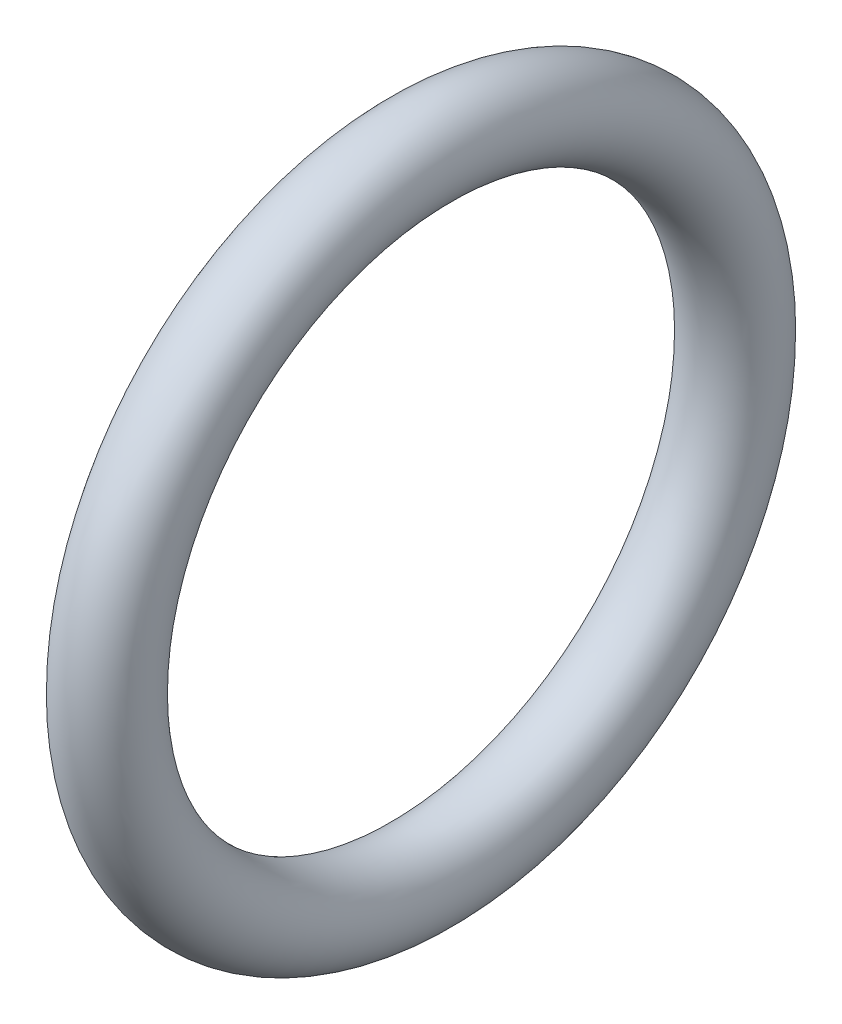
ISO-10303-21;
HEADER;
FILE_DESCRIPTION(('STEP AP214'),'2;1');
FILE_NAME('part.step','',(''),(''),'','','');
FILE_SCHEMA(('AUTOMOTIVE_DESIGN { 1 0 10303 214 1 1 1 1 }'));
ENDSEC;
DATA;
#1=APPLICATION_CONTEXT('core data for automotive mechanical design processes');
#2=APPLICATION_PROTOCOL_DEFINITION('international standard','automotive_design',2000,#1);
#3=PRODUCT_CONTEXT('',#1,'mechanical');
#4=PRODUCT('Part','Part','',(#3));
#5=PRODUCT_RELATED_PRODUCT_CATEGORY('part','',(#4));
#6=PRODUCT_DEFINITION_FORMATION('','',#4);
#7=PRODUCT_DEFINITION_CONTEXT('part definition',#1,'design');
#8=PRODUCT_DEFINITION('design','',#6,#7);
#9=PRODUCT_DEFINITION_SHAPE('','',#8);
#10=(LENGTH_UNIT() NAMED_UNIT(*) SI_UNIT(.MILLI.,.METRE.));
#11=(NAMED_UNIT(*) PLANE_ANGLE_UNIT() SI_UNIT($,.RADIAN.));
#12=(NAMED_UNIT(*) SI_UNIT($,.STERADIAN.) SOLID_ANGLE_UNIT());
#13=UNCERTAINTY_MEASURE_WITH_UNIT(LENGTH_MEASURE(1.E-05),#10,'distance_accuracy_value','');
#14=(GEOMETRIC_REPRESENTATION_CONTEXT(3) GLOBAL_UNCERTAINTY_ASSIGNED_CONTEXT((#13)) GLOBAL_UNIT_ASSIGNED_CONTEXT((#10,
#11,#12)) REPRESENTATION_CONTEXT('',''));
#15=CARTESIAN_POINT('',(0.,0.,0.));
#16=DIRECTION('',(0.,0.,1.));
#17=DIRECTION('',(1.,0.,0.));
#18=AXIS2_PLACEMENT_3D('',#15,#16,#17);
#19=CARTESIAN_POINT('',(0.,-66.,0.));
#20=DIRECTION('',(-1.,0.,0.));
#21=DIRECTION('',(0.,0.,1.));
#22=AXIS2_PLACEMENT_3D('',#19,#20,#21);
#23=TOROIDAL_SURFACE('',#22,66.,9.);
#24=CARTESIAN_POINT('',(0.,-66.,75.));
#25=VERTEX_POINT('',#24);
#26=VERTEX_LOOP('',#25);
#27=FACE_BOUND('',#26,.T.);
#28=ADVANCED_FACE('F33',(#27),#23,.T.);
#29=CLOSED_SHELL('',(#28));
#30=MANIFOLD_SOLID_BREP('B2',#29);
#31=ADVANCED_BREP_SHAPE_REPRESENTATION('',(#18,#30),#14);
#32=SHAPE_DEFINITION_REPRESENTATION(#9,#31);
ENDSEC;
END-ISO-10303-21;
